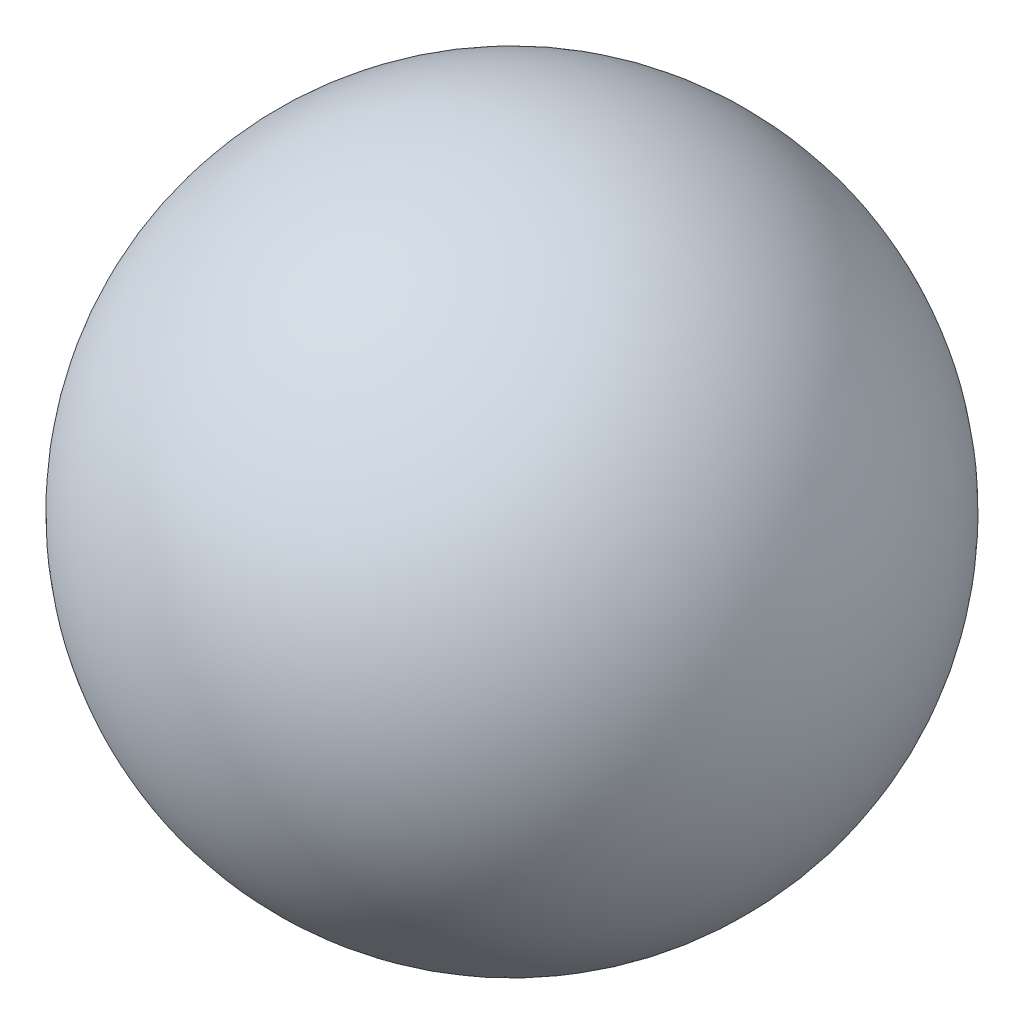
ISO-10303-21;
HEADER;
FILE_DESCRIPTION(('STEP AP214'),'2;1');
FILE_NAME('part.step','',(''),(''),'','','');
FILE_SCHEMA(('AUTOMOTIVE_DESIGN { 1 0 10303 214 1 1 1 1 }'));
ENDSEC;
DATA;
#1=APPLICATION_CONTEXT('core data for automotive mechanical design processes');
#2=APPLICATION_PROTOCOL_DEFINITION('international standard','automotive_design',2000,#1);
#3=PRODUCT_CONTEXT('',#1,'mechanical');
#4=PRODUCT('Part','Part','',(#3));
#5=PRODUCT_RELATED_PRODUCT_CATEGORY('part','',(#4));
#6=PRODUCT_DEFINITION_FORMATION('','',#4);
#7=PRODUCT_DEFINITION_CONTEXT('part definition',#1,'design');
#8=PRODUCT_DEFINITION('design','',#6,#7);
#9=PRODUCT_DEFINITION_SHAPE('','',#8);
#10=(LENGTH_UNIT() NAMED_UNIT(*) SI_UNIT(.MILLI.,.METRE.));
#11=(NAMED_UNIT(*) PLANE_ANGLE_UNIT() SI_UNIT($,.RADIAN.));
#12=(NAMED_UNIT(*) SI_UNIT($,.STERADIAN.) SOLID_ANGLE_UNIT());
#13=UNCERTAINTY_MEASURE_WITH_UNIT(LENGTH_MEASURE(1.E-05),#10,'distance_accuracy_value','');
#14=(GEOMETRIC_REPRESENTATION_CONTEXT(3) GLOBAL_UNCERTAINTY_ASSIGNED_CONTEXT((#13)) GLOBAL_UNIT_ASSIGNED_CONTEXT((#10,
#11,#12)) REPRESENTATION_CONTEXT('',''));
#15=CARTESIAN_POINT('',(0.,0.,0.));
#16=DIRECTION('',(0.,0.,1.));
#17=DIRECTION('',(1.,0.,0.));
#18=AXIS2_PLACEMENT_3D('',#15,#16,#17);
#19=CARTESIAN_POINT('',(0.,0.,0.));
#20=DIRECTION('',(0.,0.,-1.));
#21=DIRECTION('',(1.,0.,0.));
#22=AXIS2_PLACEMENT_3D('',#19,#20,#21);
#23=SPHERICAL_SURFACE('',#22,7.3);
#24=CARTESIAN_POINT('',(0.,0.,-7.3));
#25=VERTEX_POINT('',#24);
#26=VERTEX_LOOP('',#25);
#27=FACE_BOUND('',#26,.T.);
#28=ADVANCED_FACE('F31',(#27),#23,.T.);
#29=CLOSED_SHELL('',(#28));
#30=MANIFOLD_SOLID_BREP('B2',#29);
#31=ADVANCED_BREP_SHAPE_REPRESENTATION('',(#18,#30),#14);
#32=SHAPE_DEFINITION_REPRESENTATION(#9,#31);
ENDSEC;
END-ISO-10303-21;
